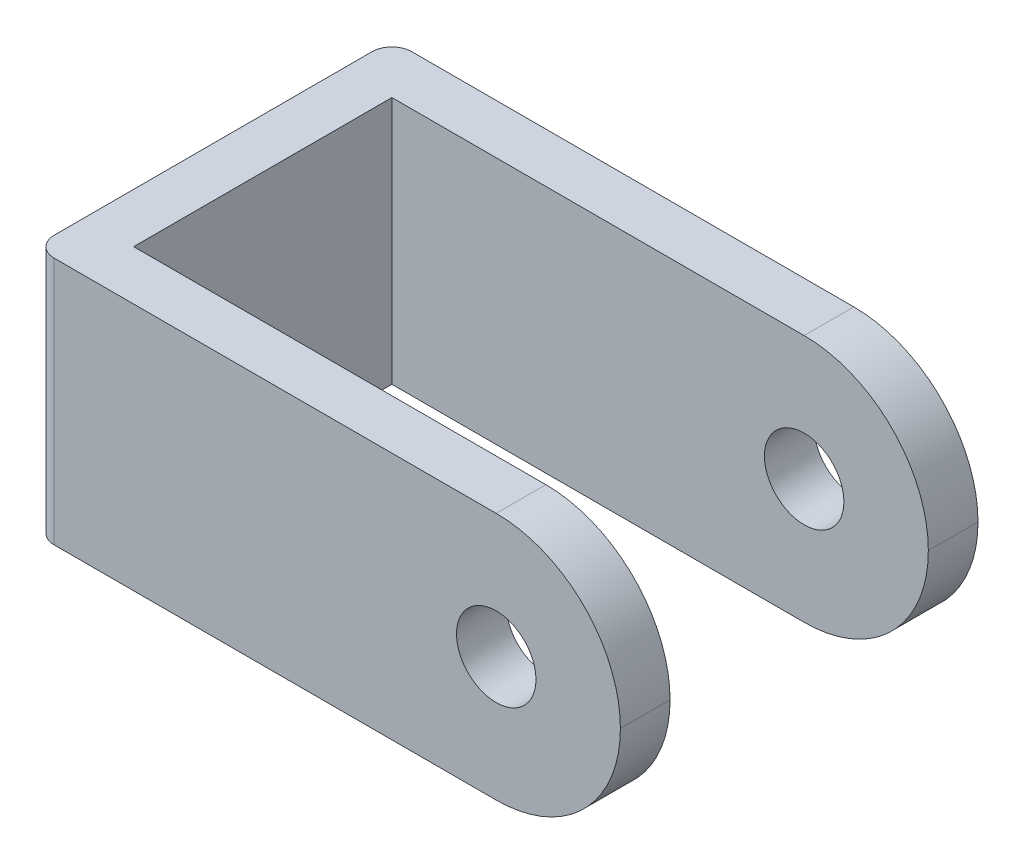
ISO-10303-21;
HEADER;
FILE_DESCRIPTION(('STEP AP214'),'2;1');
FILE_NAME('part.step','',(''),(''),'','','');
FILE_SCHEMA(('AUTOMOTIVE_DESIGN { 1 0 10303 214 1 1 1 1 }'));
ENDSEC;
DATA;
#1=APPLICATION_CONTEXT('core data for automotive mechanical design processes');
#2=APPLICATION_PROTOCOL_DEFINITION('international standard','automotive_design',2000,#1);
#3=PRODUCT_CONTEXT('',#1,'mechanical');
#4=PRODUCT('Part','Part','',(#3));
#5=PRODUCT_RELATED_PRODUCT_CATEGORY('part','',(#4));
#6=PRODUCT_DEFINITION_FORMATION('','',#4);
#7=PRODUCT_DEFINITION_CONTEXT('part definition',#1,'design');
#8=PRODUCT_DEFINITION('design','',#6,#7);
#9=PRODUCT_DEFINITION_SHAPE('','',#8);
#10=(LENGTH_UNIT() NAMED_UNIT(*) SI_UNIT(.MILLI.,.METRE.));
#11=(NAMED_UNIT(*) PLANE_ANGLE_UNIT() SI_UNIT($,.RADIAN.));
#12=(NAMED_UNIT(*) SI_UNIT($,.STERADIAN.) SOLID_ANGLE_UNIT());
#13=UNCERTAINTY_MEASURE_WITH_UNIT(LENGTH_MEASURE(1.E-05),#10,'distance_accuracy_value','');
#14=(GEOMETRIC_REPRESENTATION_CONTEXT(3) GLOBAL_UNCERTAINTY_ASSIGNED_CONTEXT((#13)) GLOBAL_UNIT_ASSIGNED_CONTEXT((#10,
#11,#12)) REPRESENTATION_CONTEXT('',''));
#15=CARTESIAN_POINT('',(0.,0.,0.));
#16=DIRECTION('',(0.,0.,1.));
#17=DIRECTION('',(1.,0.,0.));
#18=AXIS2_PLACEMENT_3D('',#15,#16,#17);
#19=CARTESIAN_POINT('',(5.,25.,13.));
#20=DIRECTION('',(-1.,0.,0.));
#21=DIRECTION('',(0.,0.,1.));
#22=AXIS2_PLACEMENT_3D('',#19,#20,#21);
#23=PLANE('',#22);
#24=DIRECTION('',(0.,0.,-1.));
#25=VECTOR('',#24,1.);
#26=CARTESIAN_POINT('',(5.,0.,13.));
#27=LINE('',#26,#25);
#28=CARTESIAN_POINT('',(5.,0.,13.));
#29=VERTEX_POINT('',#28);
#30=CARTESIAN_POINT('',(5.,0.,-13.));
#31=VERTEX_POINT('',#30);
#32=EDGE_CURVE('E148',#29,#31,#27,.T.);
#33=ORIENTED_EDGE('',*,*,#32,.T.);
#34=DIRECTION('',(0.,-1.,0.));
#35=VECTOR('',#34,1.);
#36=CARTESIAN_POINT('',(5.,25.,-13.));
#37=LINE('',#36,#35);
#38=CARTESIAN_POINT('',(5.,25.,-13.));
#39=VERTEX_POINT('',#38);
#40=EDGE_CURVE('E129',#39,#31,#37,.T.);
#41=ORIENTED_EDGE('',*,*,#40,.F.);
#42=DIRECTION('',(0.,0.,-1.));
#43=VECTOR('',#42,1.);
#44=CARTESIAN_POINT('',(5.,25.,13.));
#45=LINE('',#44,#43);
#46=CARTESIAN_POINT('',(5.,25.,13.));
#47=VERTEX_POINT('',#46);
#48=EDGE_CURVE('E137',#47,#39,#45,.T.);
#49=ORIENTED_EDGE('',*,*,#48,.F.);
#50=DIRECTION('',(0.,-1.,0.));
#51=VECTOR('',#50,1.);
#52=CARTESIAN_POINT('',(5.,25.,13.));
#53=LINE('',#52,#51);
#54=EDGE_CURVE('E204',#47,#29,#53,.T.);
#55=ORIENTED_EDGE('',*,*,#54,.T.);
#56=EDGE_LOOP('',(#33,#41,#49,#55));
#57=FACE_BOUND('',#56,.T.);
#58=ADVANCED_FACE('F34',(#57),#23,.F.);
#59=CARTESIAN_POINT('',(5.,25.,-13.));
#60=DIRECTION('',(0.,0.,-1.));
#61=DIRECTION('',(-1.,0.,0.));
#62=AXIS2_PLACEMENT_3D('',#59,#60,#61);
#63=PLANE('',#62);
#64=CARTESIAN_POINT('',(46.5,12.5,-13.));
#65=DIRECTION('',(0.,0.,-1.));
#66=DIRECTION('',(-1.,0.,0.));
#67=AXIS2_PLACEMENT_3D('',#64,#65,#66);
#68=CIRCLE('',#67,4.);
#69=CARTESIAN_POINT('',(42.5,12.5,-13.));
#70=VERTEX_POINT('',#69);
#71=EDGE_CURVE('E180',#70,#70,#68,.T.);
#72=ORIENTED_EDGE('',*,*,#71,.T.);
#73=EDGE_LOOP('',(#72));
#74=FACE_BOUND('',#73,.T.);
#75=CARTESIAN_POINT('',(46.5,12.5,-13.));
#76=DIRECTION('',(0.,0.,-1.));
#77=DIRECTION('',(-1.,0.,0.));
#78=AXIS2_PLACEMENT_3D('',#75,#76,#77);
#79=CIRCLE('',#78,12.5);
#80=CARTESIAN_POINT('',(46.5,0.,-13.));
#81=VERTEX_POINT('',#80);
#82=CARTESIAN_POINT('',(59.,12.5,-13.));
#83=VERTEX_POINT('',#82);
#84=EDGE_CURVE('E164',#81,#83,#79,.F.);
#85=ORIENTED_EDGE('',*,*,#84,.T.);
#86=CARTESIAN_POINT('',(46.5,12.5,-13.));
#87=DIRECTION('',(0.,0.,-1.));
#88=DIRECTION('',(-1.,0.,0.));
#89=AXIS2_PLACEMENT_3D('',#86,#87,#88);
#90=CIRCLE('',#89,12.5);
#91=CARTESIAN_POINT('',(46.5,25.,-13.));
#92=VERTEX_POINT('',#91);
#93=EDGE_CURVE('E132',#83,#92,#90,.F.);
#94=ORIENTED_EDGE('',*,*,#93,.T.);
#95=DIRECTION('',(1.,0.,0.));
#96=VECTOR('',#95,1.);
#97=CARTESIAN_POINT('',(5.,25.,-13.));
#98=LINE('',#97,#96);
#99=EDGE_CURVE('E124',#39,#92,#98,.T.);
#100=ORIENTED_EDGE('',*,*,#99,.F.);
#101=ORIENTED_EDGE('',*,*,#40,.T.);
#102=DIRECTION('',(1.,0.,0.));
#103=VECTOR('',#102,1.);
#104=CARTESIAN_POINT('',(5.,0.,-13.));
#105=LINE('',#104,#103);
#106=EDGE_CURVE('E206',#31,#81,#105,.T.);
#107=ORIENTED_EDGE('',*,*,#106,.T.);
#108=EDGE_LOOP('',(#85,#94,#100,#101,#107));
#109=FACE_BOUND('',#108,.T.);
#110=ADVANCED_FACE('F126',(#74,#109),#63,.F.);
#111=CARTESIAN_POINT('',(59.,25.,-18.));
#112=DIRECTION('',(0.,0.,1.));
#113=DIRECTION('',(1.,0.,0.));
#114=AXIS2_PLACEMENT_3D('',#111,#112,#113);
#115=PLANE('',#114);
#116=CARTESIAN_POINT('',(46.5,12.5,-18.));
#117=DIRECTION('',(0.,0.,1.));
#118=DIRECTION('',(1.,0.,0.));
#119=AXIS2_PLACEMENT_3D('',#116,#117,#118);
#120=CIRCLE('',#119,4.);
#121=CARTESIAN_POINT('',(50.5,12.5,-18.));
#122=VERTEX_POINT('',#121);
#123=EDGE_CURVE('E188',#122,#122,#120,.T.);
#124=ORIENTED_EDGE('',*,*,#123,.T.);
#125=EDGE_LOOP('',(#124));
#126=FACE_BOUND('',#125,.T.);
#127=DIRECTION('',(-1.,0.,0.));
#128=VECTOR('',#127,1.);
#129=CARTESIAN_POINT('',(59.,25.,-18.));
#130=LINE('',#129,#128);
#131=CARTESIAN_POINT('',(46.5,25.,-18.));
#132=VERTEX_POINT('',#131);
#133=CARTESIAN_POINT('',(2.00000000000001,25.,-18.));
#134=VERTEX_POINT('',#133);
#135=EDGE_CURVE('E136',#132,#134,#130,.T.);
#136=ORIENTED_EDGE('',*,*,#135,.F.);
#137=CARTESIAN_POINT('',(46.5,12.5,-18.));
#138=DIRECTION('',(0.,0.,1.));
#139=DIRECTION('',(1.,0.,0.));
#140=AXIS2_PLACEMENT_3D('',#137,#138,#139);
#141=CIRCLE('',#140,12.5);
#142=CARTESIAN_POINT('',(59.,12.5,-18.));
#143=VERTEX_POINT('',#142);
#144=EDGE_CURVE('E162',#132,#143,#141,.F.);
#145=ORIENTED_EDGE('',*,*,#144,.T.);
#146=CARTESIAN_POINT('',(46.5,12.5,-18.));
#147=DIRECTION('',(0.,0.,1.));
#148=DIRECTION('',(1.,0.,0.));
#149=AXIS2_PLACEMENT_3D('',#146,#147,#148);
#150=CIRCLE('',#149,12.5);
#151=CARTESIAN_POINT('',(46.5,0.,-18.));
#152=VERTEX_POINT('',#151);
#153=EDGE_CURVE('E160',#143,#152,#150,.F.);
#154=ORIENTED_EDGE('',*,*,#153,.T.);
#155=DIRECTION('',(-1.,0.,0.));
#156=VECTOR('',#155,1.);
#157=CARTESIAN_POINT('',(59.,0.,-18.));
#158=LINE('',#157,#156);
#159=CARTESIAN_POINT('',(2.00000000000001,0.,-18.));
#160=VERTEX_POINT('',#159);
#161=EDGE_CURVE('E208',#152,#160,#158,.T.);
#162=ORIENTED_EDGE('',*,*,#161,.T.);
#163=DIRECTION('',(0.,-1.,0.));
#164=VECTOR('',#163,1.);
#165=CARTESIAN_POINT('',(2.00000000000001,25.,-18.));
#166=LINE('',#165,#164);
#167=EDGE_CURVE('E150',#134,#160,#166,.T.);
#168=ORIENTED_EDGE('',*,*,#167,.F.);
#169=EDGE_LOOP('',(#136,#145,#154,#162,#168));
#170=FACE_BOUND('',#169,.T.);
#171=ADVANCED_FACE('F263',(#126,#170),#115,.F.);
#172=CARTESIAN_POINT('',(2.,25.,-16.));
#173=DIRECTION('',(0.,-1.,0.));
#174=DIRECTION('',(0.,0.,-1.));
#175=AXIS2_PLACEMENT_3D('',#172,#173,#174);
#176=CYLINDRICAL_SURFACE('',#175,2.);
#177=CARTESIAN_POINT('',(2.,0.,-16.));
#178=DIRECTION('',(0.,1.,0.));
#179=DIRECTION('',(0.,0.,-1.));
#180=AXIS2_PLACEMENT_3D('',#177,#178,#179);
#181=CIRCLE('',#180,2.);
#182=CARTESIAN_POINT('',(0.,0.,-16.));
#183=VERTEX_POINT('',#182);
#184=EDGE_CURVE('E210',#160,#183,#181,.T.);
#185=ORIENTED_EDGE('',*,*,#184,.T.);
#186=DIRECTION('',(0.,-1.,0.));
#187=VECTOR('',#186,1.);
#188=CARTESIAN_POINT('',(0.,25.,-16.));
#189=LINE('',#188,#187);
#190=CARTESIAN_POINT('',(0.,25.,-16.));
#191=VERTEX_POINT('',#190);
#192=EDGE_CURVE('E155',#191,#183,#189,.T.);
#193=ORIENTED_EDGE('',*,*,#192,.F.);
#194=CARTESIAN_POINT('',(2.,25.,-16.));
#195=DIRECTION('',(0.,1.,0.));
#196=DIRECTION('',(0.,0.,-1.));
#197=AXIS2_PLACEMENT_3D('',#194,#195,#196);
#198=CIRCLE('',#197,2.);
#199=EDGE_CURVE('E194',#134,#191,#198,.T.);
#200=ORIENTED_EDGE('',*,*,#199,.F.);
#201=ORIENTED_EDGE('',*,*,#167,.T.);
#202=EDGE_LOOP('',(#185,#193,#200,#201));
#203=FACE_BOUND('',#202,.T.);
#204=ADVANCED_FACE('F264',(#203),#176,.T.);
#205=CARTESIAN_POINT('',(0.,25.,-16.));
#206=DIRECTION('',(1.,0.,0.));
#207=DIRECTION('',(0.,0.,-1.));
#208=AXIS2_PLACEMENT_3D('',#205,#206,#207);
#209=PLANE('',#208);
#210=DIRECTION('',(0.,0.,1.));
#211=VECTOR('',#210,1.);
#212=CARTESIAN_POINT('',(0.,0.,-16.));
#213=LINE('',#212,#211);
#214=CARTESIAN_POINT('',(0.,0.,16.));
#215=VERTEX_POINT('',#214);
#216=EDGE_CURVE('E212',#183,#215,#213,.T.);
#217=ORIENTED_EDGE('',*,*,#216,.T.);
#218=DIRECTION('',(0.,-1.,0.));
#219=VECTOR('',#218,1.);
#220=CARTESIAN_POINT('',(0.,25.,16.));
#221=LINE('',#220,#219);
#222=CARTESIAN_POINT('',(0.,25.,16.));
#223=VERTEX_POINT('',#222);
#224=EDGE_CURVE('E223',#223,#215,#221,.T.);
#225=ORIENTED_EDGE('',*,*,#224,.F.);
#226=DIRECTION('',(0.,0.,1.));
#227=VECTOR('',#226,1.);
#228=CARTESIAN_POINT('',(0.,25.,-16.));
#229=LINE('',#228,#227);
#230=EDGE_CURVE('E196',#191,#223,#229,.T.);
#231=ORIENTED_EDGE('',*,*,#230,.F.);
#232=ORIENTED_EDGE('',*,*,#192,.T.);
#233=EDGE_LOOP('',(#217,#225,#231,#232));
#234=FACE_BOUND('',#233,.T.);
#235=ADVANCED_FACE('F230',(#234),#209,.F.);
#236=CARTESIAN_POINT('',(2.,25.,16.));
#237=DIRECTION('',(0.,-1.,0.));
#238=DIRECTION('',(0.,0.,-1.));
#239=AXIS2_PLACEMENT_3D('',#236,#237,#238);
#240=CYLINDRICAL_SURFACE('',#239,2.);
#241=CARTESIAN_POINT('',(2.,0.,16.));
#242=DIRECTION('',(0.,1.,0.));
#243=DIRECTION('',(0.,0.,-1.));
#244=AXIS2_PLACEMENT_3D('',#241,#242,#243);
#245=CIRCLE('',#244,2.);
#246=CARTESIAN_POINT('',(2.00000000000001,0.,18.));
#247=VERTEX_POINT('',#246);
#248=EDGE_CURVE('E214',#215,#247,#245,.T.);
#249=ORIENTED_EDGE('',*,*,#248,.T.);
#250=DIRECTION('',(0.,-1.,0.));
#251=VECTOR('',#250,1.);
#252=CARTESIAN_POINT('',(2.00000000000001,25.,18.));
#253=LINE('',#252,#251);
#254=CARTESIAN_POINT('',(2.00000000000001,25.,18.));
#255=VERTEX_POINT('',#254);
#256=EDGE_CURVE('E220',#255,#247,#253,.T.);
#257=ORIENTED_EDGE('',*,*,#256,.F.);
#258=CARTESIAN_POINT('',(2.,25.,16.));
#259=DIRECTION('',(0.,1.,0.));
#260=DIRECTION('',(0.,0.,-1.));
#261=AXIS2_PLACEMENT_3D('',#258,#259,#260);
#262=CIRCLE('',#261,2.);
#263=EDGE_CURVE('E198',#223,#255,#262,.T.);
#264=ORIENTED_EDGE('',*,*,#263,.F.);
#265=ORIENTED_EDGE('',*,*,#224,.T.);
#266=EDGE_LOOP('',(#249,#257,#264,#265));
#267=FACE_BOUND('',#266,.T.);
#268=ADVANCED_FACE('F242',(#267),#240,.T.);
#269=CARTESIAN_POINT('',(2.00000000000001,25.,18.));
#270=DIRECTION('',(0.,0.,-1.));
#271=DIRECTION('',(-1.,0.,0.));
#272=AXIS2_PLACEMENT_3D('',#269,#270,#271);
#273=PLANE('',#272);
#274=CARTESIAN_POINT('',(46.5,12.5,18.));
#275=DIRECTION('',(0.,0.,1.));
#276=DIRECTION('',(1.,0.,0.));
#277=AXIS2_PLACEMENT_3D('',#274,#275,#276);
#278=CIRCLE('',#277,4.);
#279=CARTESIAN_POINT('',(50.5,12.5,18.));
#280=VERTEX_POINT('',#279);
#281=EDGE_CURVE('E190',#280,#280,#278,.T.);
#282=ORIENTED_EDGE('',*,*,#281,.F.);
#283=EDGE_LOOP('',(#282));
#284=FACE_BOUND('',#283,.T.);
#285=DIRECTION('',(1.,0.,0.));
#286=VECTOR('',#285,1.);
#287=CARTESIAN_POINT('',(2.00000000000001,0.,18.));
#288=LINE('',#287,#286);
#289=CARTESIAN_POINT('',(46.5,0.,18.));
#290=VERTEX_POINT('',#289);
#291=EDGE_CURVE('E216',#247,#290,#288,.T.);
#292=ORIENTED_EDGE('',*,*,#291,.T.);
#293=CARTESIAN_POINT('',(46.5,12.5,18.));
#294=DIRECTION('',(0.,0.,-1.));
#295=DIRECTION('',(-1.,0.,0.));
#296=AXIS2_PLACEMENT_3D('',#293,#294,#295);
#297=CIRCLE('',#296,12.5);
#298=CARTESIAN_POINT('',(59.,12.5,18.));
#299=VERTEX_POINT('',#298);
#300=EDGE_CURVE('E11',#290,#299,#297,.F.);
#301=ORIENTED_EDGE('',*,*,#300,.T.);
#302=CARTESIAN_POINT('',(46.5,12.5,18.));
#303=DIRECTION('',(0.,0.,-1.));
#304=DIRECTION('',(-1.,0.,0.));
#305=AXIS2_PLACEMENT_3D('',#302,#303,#304);
#306=CIRCLE('',#305,12.5);
#307=CARTESIAN_POINT('',(46.5,25.,18.));
#308=VERTEX_POINT('',#307);
#309=EDGE_CURVE('E43',#299,#308,#306,.F.);
#310=ORIENTED_EDGE('',*,*,#309,.T.);
#311=DIRECTION('',(1.,0.,0.));
#312=VECTOR('',#311,1.);
#313=CARTESIAN_POINT('',(2.00000000000001,25.,18.));
#314=LINE('',#313,#312);
#315=EDGE_CURVE('E200',#255,#308,#314,.T.);
#316=ORIENTED_EDGE('',*,*,#315,.F.);
#317=ORIENTED_EDGE('',*,*,#256,.T.);
#318=EDGE_LOOP('',(#292,#301,#310,#316,#317));
#319=FACE_BOUND('',#318,.T.);
#320=ADVANCED_FACE('F245',(#284,#319),#273,.F.);
#321=CARTESIAN_POINT('',(59.,25.,13.));
#322=DIRECTION('',(0.,0.,1.));
#323=DIRECTION('',(1.,0.,0.));
#324=AXIS2_PLACEMENT_3D('',#321,#322,#323);
#325=PLANE('',#324);
#326=CARTESIAN_POINT('',(46.5,12.5,13.));
#327=DIRECTION('',(0.,0.,1.));
#328=DIRECTION('',(1.,0.,0.));
#329=AXIS2_PLACEMENT_3D('',#326,#327,#328);
#330=CIRCLE('',#329,4.);
#331=CARTESIAN_POINT('',(50.5,12.5,13.));
#332=VERTEX_POINT('',#331);
#333=EDGE_CURVE('E38',#332,#332,#330,.T.);
#334=ORIENTED_EDGE('',*,*,#333,.T.);
#335=EDGE_LOOP('',(#334));
#336=FACE_BOUND('',#335,.T.);
#337=CARTESIAN_POINT('',(46.5,12.5,13.));
#338=DIRECTION('',(0.,0.,1.));
#339=DIRECTION('',(1.,0.,0.));
#340=AXIS2_PLACEMENT_3D('',#337,#338,#339);
#341=CIRCLE('',#340,12.5);
#342=CARTESIAN_POINT('',(46.5,25.,13.));
#343=VERTEX_POINT('',#342);
#344=CARTESIAN_POINT('',(59.,12.5,13.));
#345=VERTEX_POINT('',#344);
#346=EDGE_CURVE('E57',#343,#345,#341,.F.);
#347=ORIENTED_EDGE('',*,*,#346,.T.);
#348=CARTESIAN_POINT('',(46.5,12.5,13.));
#349=DIRECTION('',(0.,0.,1.));
#350=DIRECTION('',(1.,0.,0.));
#351=AXIS2_PLACEMENT_3D('',#348,#349,#350);
#352=CIRCLE('',#351,12.5);
#353=CARTESIAN_POINT('',(46.5,0.,13.));
#354=VERTEX_POINT('',#353);
#355=EDGE_CURVE('E173',#345,#354,#352,.F.);
#356=ORIENTED_EDGE('',*,*,#355,.T.);
#357=DIRECTION('',(-1.,0.,0.));
#358=VECTOR('',#357,1.);
#359=CARTESIAN_POINT('',(59.,0.,13.));
#360=LINE('',#359,#358);
#361=EDGE_CURVE('E145',#354,#29,#360,.T.);
#362=ORIENTED_EDGE('',*,*,#361,.T.);
#363=ORIENTED_EDGE('',*,*,#54,.F.);
#364=DIRECTION('',(-1.,0.,0.));
#365=VECTOR('',#364,1.);
#366=CARTESIAN_POINT('',(59.,25.,13.));
#367=LINE('',#366,#365);
#368=EDGE_CURVE('E141',#343,#47,#367,.T.);
#369=ORIENTED_EDGE('',*,*,#368,.F.);
#370=EDGE_LOOP('',(#347,#356,#362,#363,#369));
#371=FACE_BOUND('',#370,.T.);
#372=ADVANCED_FACE('F251',(#336,#371),#325,.F.);
#373=CARTESIAN_POINT('',(2.,25.,-16.));
#374=DIRECTION('',(0.,-1.,0.));
#375=DIRECTION('',(0.,0.,-1.));
#376=AXIS2_PLACEMENT_3D('',#373,#374,#375);
#377=PLANE('',#376);
#378=ORIENTED_EDGE('',*,*,#99,.T.);
#379=DIRECTION('',(0.,0.,-1.));
#380=VECTOR('',#379,1.);
#381=CARTESIAN_POINT('',(46.5,25.,-16.));
#382=LINE('',#381,#380);
#383=EDGE_CURVE('E152',#92,#132,#382,.T.);
#384=ORIENTED_EDGE('',*,*,#383,.T.);
#385=ORIENTED_EDGE('',*,*,#135,.T.);
#386=ORIENTED_EDGE('',*,*,#199,.T.);
#387=ORIENTED_EDGE('',*,*,#230,.T.);
#388=ORIENTED_EDGE('',*,*,#263,.T.);
#389=ORIENTED_EDGE('',*,*,#315,.T.);
#390=DIRECTION('',(0.,0.,-1.));
#391=VECTOR('',#390,1.);
#392=CARTESIAN_POINT('',(46.5,25.,-16.));
#393=LINE('',#392,#391);
#394=EDGE_CURVE('E149',#308,#343,#393,.T.);
#395=ORIENTED_EDGE('',*,*,#394,.T.);
#396=ORIENTED_EDGE('',*,*,#368,.T.);
#397=ORIENTED_EDGE('',*,*,#48,.T.);
#398=EDGE_LOOP('',(#378,#384,#385,#386,#387,#388,#389,#395,#396,#397));
#399=FACE_BOUND('',#398,.T.);
#400=ADVANCED_FACE('F140',(#399),#377,.F.);
#401=CARTESIAN_POINT('',(2.,0.,-16.));
#402=DIRECTION('',(0.,-1.,0.));
#403=DIRECTION('',(0.,0.,-1.));
#404=AXIS2_PLACEMENT_3D('',#401,#402,#403);
#405=PLANE('',#404);
#406=ORIENTED_EDGE('',*,*,#161,.F.);
#407=DIRECTION('',(0.,0.,-1.));
#408=VECTOR('',#407,1.);
#409=CARTESIAN_POINT('',(46.5,0.,-13.));
#410=LINE('',#409,#408);
#411=EDGE_CURVE('E170',#152,#81,#410,.F.);
#412=ORIENTED_EDGE('',*,*,#411,.T.);
#413=ORIENTED_EDGE('',*,*,#106,.F.);
#414=ORIENTED_EDGE('',*,*,#32,.F.);
#415=ORIENTED_EDGE('',*,*,#361,.F.);
#416=DIRECTION('',(0.,0.,-1.));
#417=VECTOR('',#416,1.);
#418=CARTESIAN_POINT('',(46.5,0.,18.));
#419=LINE('',#418,#417);
#420=EDGE_CURVE('E167',#354,#290,#419,.F.);
#421=ORIENTED_EDGE('',*,*,#420,.T.);
#422=ORIENTED_EDGE('',*,*,#291,.F.);
#423=ORIENTED_EDGE('',*,*,#248,.F.);
#424=ORIENTED_EDGE('',*,*,#216,.F.);
#425=ORIENTED_EDGE('',*,*,#184,.F.);
#426=EDGE_LOOP('',(#406,#412,#413,#414,#415,#421,#422,#423,#424,#425));
#427=FACE_BOUND('',#426,.T.);
#428=ADVANCED_FACE('F238',(#427),#405,.T.);
#429=CARTESIAN_POINT('',(46.5,12.5,-13.));
#430=DIRECTION('',(0.,0.,1.));
#431=DIRECTION('',(1.,0.,0.));
#432=AXIS2_PLACEMENT_3D('',#429,#430,#431);
#433=CYLINDRICAL_SURFACE('',#432,12.5);
#434=DIRECTION('',(0.,0.,-1.));
#435=VECTOR('',#434,1.);
#436=CARTESIAN_POINT('',(59.,12.5,-18.));
#437=LINE('',#436,#435);
#438=EDGE_CURVE('E176',#83,#143,#437,.T.);
#439=ORIENTED_EDGE('',*,*,#438,.F.);
#440=ORIENTED_EDGE('',*,*,#84,.F.);
#441=ORIENTED_EDGE('',*,*,#411,.F.);
#442=ORIENTED_EDGE('',*,*,#153,.F.);
#443=EDGE_LOOP('',(#439,#440,#441,#442));
#444=FACE_BOUND('',#443,.T.);
#445=ADVANCED_FACE('F256',(#444),#433,.T.);
#446=CARTESIAN_POINT('',(46.5,12.5,-16.));
#447=DIRECTION('',(0.,0.,-1.));
#448=DIRECTION('',(-1.,0.,0.));
#449=AXIS2_PLACEMENT_3D('',#446,#447,#448);
#450=CYLINDRICAL_SURFACE('',#449,12.5);
#451=ORIENTED_EDGE('',*,*,#93,.F.);
#452=ORIENTED_EDGE('',*,*,#438,.T.);
#453=ORIENTED_EDGE('',*,*,#144,.F.);
#454=ORIENTED_EDGE('',*,*,#383,.F.);
#455=EDGE_LOOP('',(#451,#452,#453,#454));
#456=FACE_BOUND('',#455,.T.);
#457=ADVANCED_FACE('F259',(#456),#450,.T.);
#458=CARTESIAN_POINT('',(46.5,12.5,-16.));
#459=DIRECTION('',(0.,0.,-1.));
#460=DIRECTION('',(-1.,0.,0.));
#461=AXIS2_PLACEMENT_3D('',#458,#459,#460);
#462=CYLINDRICAL_SURFACE('',#461,12.5);
#463=ORIENTED_EDGE('',*,*,#394,.F.);
#464=ORIENTED_EDGE('',*,*,#309,.F.);
#465=DIRECTION('',(0.,0.,-1.));
#466=VECTOR('',#465,1.);
#467=CARTESIAN_POINT('',(59.,12.5,18.));
#468=LINE('',#467,#466);
#469=EDGE_CURVE('E178',#345,#299,#468,.F.);
#470=ORIENTED_EDGE('',*,*,#469,.F.);
#471=ORIENTED_EDGE('',*,*,#346,.F.);
#472=EDGE_LOOP('',(#463,#464,#470,#471));
#473=FACE_BOUND('',#472,.T.);
#474=ADVANCED_FACE('F36',(#473),#462,.T.);
#475=CARTESIAN_POINT('',(46.5,12.5,18.));
#476=DIRECTION('',(0.,0.,1.));
#477=DIRECTION('',(1.,0.,0.));
#478=AXIS2_PLACEMENT_3D('',#475,#476,#477);
#479=CYLINDRICAL_SURFACE('',#478,12.5);
#480=ORIENTED_EDGE('',*,*,#300,.F.);
#481=ORIENTED_EDGE('',*,*,#420,.F.);
#482=ORIENTED_EDGE('',*,*,#355,.F.);
#483=ORIENTED_EDGE('',*,*,#469,.T.);
#484=EDGE_LOOP('',(#480,#481,#482,#483));
#485=FACE_BOUND('',#484,.T.);
#486=ADVANCED_FACE('F249',(#485),#479,.T.);
#487=CARTESIAN_POINT('',(46.5,12.5,-18.));
#488=DIRECTION('',(0.,0.,1.));
#489=DIRECTION('',(1.,0.,0.));
#490=AXIS2_PLACEMENT_3D('',#487,#488,#489);
#491=CYLINDRICAL_SURFACE('',#490,4.);
#492=ORIENTED_EDGE('',*,*,#281,.T.);
#493=EDGE_LOOP('',(#492));
#494=FACE_BOUND('',#493,.T.);
#495=ORIENTED_EDGE('',*,*,#333,.F.);
#496=EDGE_LOOP('',(#495));
#497=FACE_BOUND('',#496,.T.);
#498=ADVANCED_FACE('F285',(#494,#497),#491,.F.);
#499=ORIENTED_EDGE('',*,*,#123,.F.);
#500=EDGE_LOOP('',(#499));
#501=FACE_BOUND('',#500,.T.);
#502=ORIENTED_EDGE('',*,*,#71,.F.);
#503=EDGE_LOOP('',(#502));
#504=FACE_BOUND('',#503,.T.);
#505=ADVANCED_FACE('F290',(#501,#504),#491,.F.);
#506=CLOSED_SHELL('',(#58,#110,#171,#204,#235,#268,#320,#372,#400,#428,#445,#457,#474,#486,#498,#505));
#507=MANIFOLD_SOLID_BREP('B2',#506);
#508=ADVANCED_BREP_SHAPE_REPRESENTATION('',(#18,#507),#14);
#509=SHAPE_DEFINITION_REPRESENTATION(#9,#508);
ENDSEC;
END-ISO-10303-21;
